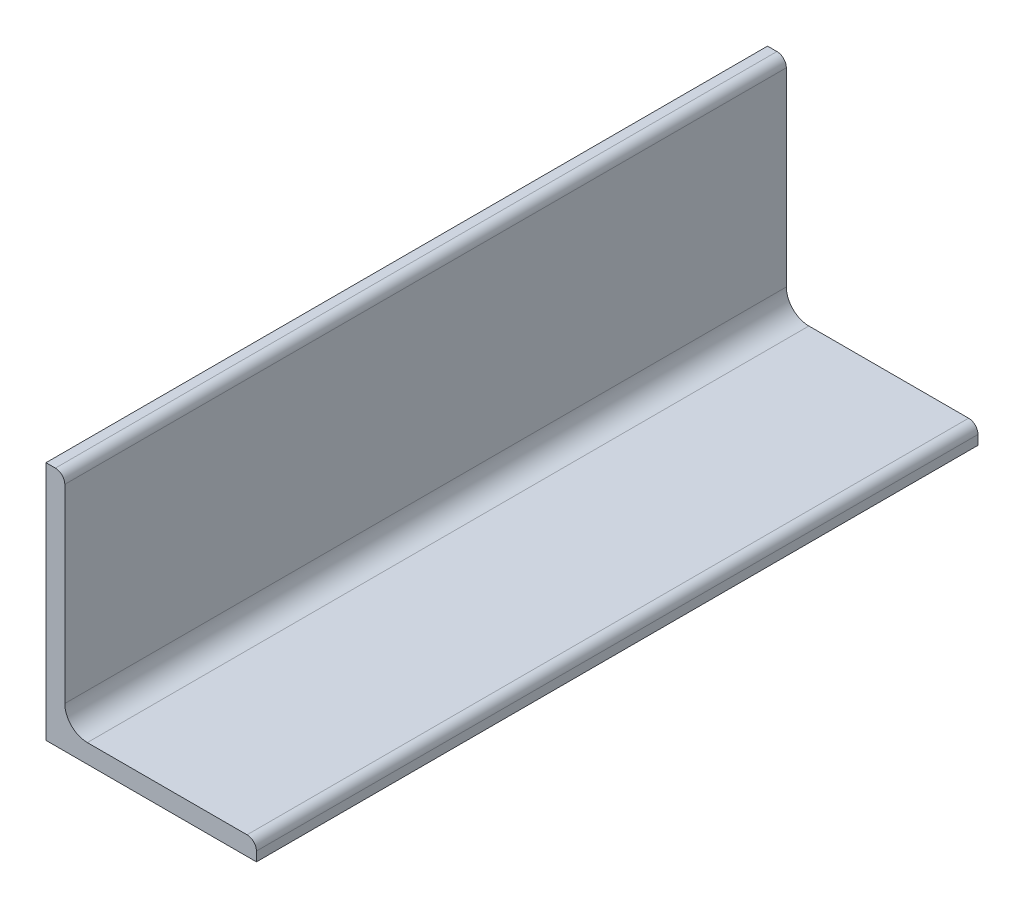
ISO-10303-21;
HEADER;
FILE_DESCRIPTION(('STEP AP214'),'2;1');
FILE_NAME('part.step','',(''),(''),'','','');
FILE_SCHEMA(('AUTOMOTIVE_DESIGN { 1 0 10303 214 1 1 1 1 }'));
ENDSEC;
DATA;
#1=APPLICATION_CONTEXT('core data for automotive mechanical design processes');
#2=APPLICATION_PROTOCOL_DEFINITION('international standard','automotive_design',2000,#1);
#3=PRODUCT_CONTEXT('',#1,'mechanical');
#4=PRODUCT('Part','Part','',(#3));
#5=PRODUCT_RELATED_PRODUCT_CATEGORY('part','',(#4));
#6=PRODUCT_DEFINITION_FORMATION('','',#4);
#7=PRODUCT_DEFINITION_CONTEXT('part definition',#1,'design');
#8=PRODUCT_DEFINITION('design','',#6,#7);
#9=PRODUCT_DEFINITION_SHAPE('','',#8);
#10=(LENGTH_UNIT() NAMED_UNIT(*) SI_UNIT(.MILLI.,.METRE.));
#11=(NAMED_UNIT(*) PLANE_ANGLE_UNIT() SI_UNIT($,.RADIAN.));
#12=(NAMED_UNIT(*) SI_UNIT($,.STERADIAN.) SOLID_ANGLE_UNIT());
#13=UNCERTAINTY_MEASURE_WITH_UNIT(LENGTH_MEASURE(1.E-05),#10,'distance_accuracy_value','');
#14=(GEOMETRIC_REPRESENTATION_CONTEXT(3) GLOBAL_UNCERTAINTY_ASSIGNED_CONTEXT((#13)) GLOBAL_UNIT_ASSIGNED_CONTEXT((#10,
#11,#12)) REPRESENTATION_CONTEXT('',''));
#15=CARTESIAN_POINT('',(0.,0.,0.));
#16=DIRECTION('',(0.,0.,1.));
#17=DIRECTION('',(1.,0.,0.));
#18=AXIS2_PLACEMENT_3D('',#15,#16,#17);
#19=CARTESIAN_POINT('',(0.0836264027816469,102.172018782971,304.8));
#20=DIRECTION('',(1.,0.,0.));
#21=DIRECTION('',(0.,0.,-1.));
#22=AXIS2_PLACEMENT_3D('',#19,#20,#21);
#23=PLANE('',#22);
#24=DIRECTION('',(0.,-1.,0.));
#25=VECTOR('',#24,1.);
#26=CARTESIAN_POINT('',(0.0836264027816469,102.172018782971,0.));
#27=LINE('',#26,#25);
#28=CARTESIAN_POINT('',(0.0836264027816469,102.172018782971,0.));
#29=VERTEX_POINT('',#28);
#30=CARTESIAN_POINT('',(0.0836264027816469,0.572018782971054,0.));
#31=VERTEX_POINT('',#30);
#32=EDGE_CURVE('E135',#29,#31,#27,.T.);
#33=ORIENTED_EDGE('',*,*,#32,.T.);
#34=DIRECTION('',(0.,0.,-1.));
#35=VECTOR('',#34,1.);
#36=CARTESIAN_POINT('',(0.0836264027816469,0.572018782971054,304.8));
#37=LINE('',#36,#35);
#38=CARTESIAN_POINT('',(0.0836264027816469,0.572018782971054,304.8));
#39=VERTEX_POINT('',#38);
#40=EDGE_CURVE('E11',#39,#31,#37,.T.);
#41=ORIENTED_EDGE('',*,*,#40,.F.);
#42=DIRECTION('',(0.,-1.,0.));
#43=VECTOR('',#42,1.);
#44=CARTESIAN_POINT('',(0.0836264027816469,102.172018782971,304.8));
#45=LINE('',#44,#43);
#46=CARTESIAN_POINT('',(0.0836264027816469,102.172018782971,304.8));
#47=VERTEX_POINT('',#46);
#48=EDGE_CURVE('E151',#47,#39,#45,.T.);
#49=ORIENTED_EDGE('',*,*,#48,.F.);
#50=DIRECTION('',(0.,0.,-1.));
#51=VECTOR('',#50,1.);
#52=CARTESIAN_POINT('',(0.0836264027816469,102.172018782971,304.8));
#53=LINE('',#52,#51);
#54=EDGE_CURVE('E131',#47,#29,#53,.T.);
#55=ORIENTED_EDGE('',*,*,#54,.T.);
#56=EDGE_LOOP('',(#33,#41,#49,#55));
#57=FACE_BOUND('',#56,.T.);
#58=ADVANCED_FACE('F33',(#57),#23,.F.);
#59=CARTESIAN_POINT('',(0.0836264027816469,0.572018782971054,304.8));
#60=DIRECTION('',(0.,1.,0.));
#61=DIRECTION('',(0.,0.,1.));
#62=AXIS2_PLACEMENT_3D('',#59,#60,#61);
#63=PLANE('',#62);
#64=DIRECTION('',(1.,0.,0.));
#65=VECTOR('',#64,1.);
#66=CARTESIAN_POINT('',(0.0836264027816469,0.572018782971054,0.));
#67=LINE('',#66,#65);
#68=CARTESIAN_POINT('',(88.9836264027817,0.572018782971054,0.));
#69=VERTEX_POINT('',#68);
#70=EDGE_CURVE('E138',#31,#69,#67,.T.);
#71=ORIENTED_EDGE('',*,*,#70,.T.);
#72=DIRECTION('',(0.,0.,-1.));
#73=VECTOR('',#72,1.);
#74=CARTESIAN_POINT('',(88.9836264027817,0.572018782971054,304.8));
#75=LINE('',#74,#73);
#76=CARTESIAN_POINT('',(88.9836264027817,0.572018782971054,304.8));
#77=VERTEX_POINT('',#76);
#78=EDGE_CURVE('E41',#77,#69,#75,.T.);
#79=ORIENTED_EDGE('',*,*,#78,.F.);
#80=DIRECTION('',(1.,0.,0.));
#81=VECTOR('',#80,1.);
#82=CARTESIAN_POINT('',(0.0836264027816469,0.572018782971054,304.8));
#83=LINE('',#82,#81);
#84=EDGE_CURVE('E95',#39,#77,#83,.T.);
#85=ORIENTED_EDGE('',*,*,#84,.F.);
#86=ORIENTED_EDGE('',*,*,#40,.T.);
#87=EDGE_LOOP('',(#71,#79,#85,#86));
#88=FACE_BOUND('',#87,.T.);
#89=ADVANCED_FACE('F194',(#88),#63,.F.);
#90=CARTESIAN_POINT('',(88.9836264027817,0.572018782971054,304.8));
#91=DIRECTION('',(-1.,0.,0.));
#92=DIRECTION('',(0.,0.,1.));
#93=AXIS2_PLACEMENT_3D('',#90,#91,#92);
#94=PLANE('',#93);
#95=DIRECTION('',(0.,1.,0.));
#96=VECTOR('',#95,1.);
#97=CARTESIAN_POINT('',(88.9836264027817,0.572018782971054,0.));
#98=LINE('',#97,#96);
#99=CARTESIAN_POINT('',(88.9836264027817,4.54076878297105,0.));
#100=VERTEX_POINT('',#99);
#101=EDGE_CURVE('E140',#69,#100,#98,.T.);
#102=ORIENTED_EDGE('',*,*,#101,.T.);
#103=DIRECTION('',(0.,0.,-1.));
#104=VECTOR('',#103,1.);
#105=CARTESIAN_POINT('',(88.9836264027817,4.54076878297105,304.8));
#106=LINE('',#105,#104);
#107=CARTESIAN_POINT('',(88.9836264027817,4.54076878297105,304.8));
#108=VERTEX_POINT('',#107);
#109=EDGE_CURVE('E161',#108,#100,#106,.T.);
#110=ORIENTED_EDGE('',*,*,#109,.F.);
#111=DIRECTION('',(0.,1.,0.));
#112=VECTOR('',#111,1.);
#113=CARTESIAN_POINT('',(88.9836264027817,0.572018782971054,304.8));
#114=LINE('',#113,#112);
#115=EDGE_CURVE('E169',#77,#108,#114,.T.);
#116=ORIENTED_EDGE('',*,*,#115,.F.);
#117=ORIENTED_EDGE('',*,*,#78,.T.);
#118=EDGE_LOOP('',(#102,#110,#116,#117));
#119=FACE_BOUND('',#118,.T.);
#120=ADVANCED_FACE('F167',(#119),#94,.F.);
#121=CARTESIAN_POINT('',(85.0148764027816,4.54076878297105,304.8));
#122=DIRECTION('',(0.,0.,-1.));
#123=DIRECTION('',(-1.,0.,0.));
#124=AXIS2_PLACEMENT_3D('',#121,#122,#123);
#125=CYLINDRICAL_SURFACE('',#124,3.96875);
#126=CARTESIAN_POINT('',(85.0148764027816,4.54076878297105,0.));
#127=DIRECTION('',(0.,0.,1.));
#128=DIRECTION('',(1.,0.,0.));
#129=AXIS2_PLACEMENT_3D('',#126,#127,#128);
#130=CIRCLE('',#129,3.96875);
#131=CARTESIAN_POINT('',(85.0148764027816,8.50951878297106,0.));
#132=VERTEX_POINT('',#131);
#133=EDGE_CURVE('E142',#100,#132,#130,.T.);
#134=ORIENTED_EDGE('',*,*,#133,.T.);
#135=DIRECTION('',(0.,0.,-1.));
#136=VECTOR('',#135,1.);
#137=CARTESIAN_POINT('',(85.0148764027816,8.50951878297106,304.8));
#138=LINE('',#137,#136);
#139=CARTESIAN_POINT('',(85.0148764027816,8.50951878297106,304.8));
#140=VERTEX_POINT('',#139);
#141=EDGE_CURVE('E158',#140,#132,#138,.T.);
#142=ORIENTED_EDGE('',*,*,#141,.F.);
#143=CARTESIAN_POINT('',(85.0148764027816,4.54076878297105,304.8));
#144=DIRECTION('',(0.,0.,1.));
#145=DIRECTION('',(1.,0.,0.));
#146=AXIS2_PLACEMENT_3D('',#143,#144,#145);
#147=CIRCLE('',#146,3.96875);
#148=EDGE_CURVE('E185',#108,#140,#147,.T.);
#149=ORIENTED_EDGE('',*,*,#148,.F.);
#150=ORIENTED_EDGE('',*,*,#109,.T.);
#151=EDGE_LOOP('',(#134,#142,#149,#150));
#152=FACE_BOUND('',#151,.T.);
#153=ADVANCED_FACE('F178',(#152),#125,.T.);
#154=CARTESIAN_POINT('',(85.0148764027816,8.50951878297105,304.8));
#155=DIRECTION('',(0.,-1.,0.));
#156=DIRECTION('',(0.,0.,-1.));
#157=AXIS2_PLACEMENT_3D('',#154,#155,#156);
#158=PLANE('',#157);
#159=DIRECTION('',(-1.,0.,0.));
#160=VECTOR('',#159,1.);
#161=CARTESIAN_POINT('',(85.0148764027816,8.50951878297105,0.));
#162=LINE('',#161,#160);
#163=CARTESIAN_POINT('',(17.5461264027816,8.50951878297105,0.));
#164=VERTEX_POINT('',#163);
#165=EDGE_CURVE('E144',#132,#164,#162,.T.);
#166=ORIENTED_EDGE('',*,*,#165,.T.);
#167=DIRECTION('',(0.,0.,-1.));
#168=VECTOR('',#167,1.);
#169=CARTESIAN_POINT('',(17.5461264027816,8.50951878297105,304.8));
#170=LINE('',#169,#168);
#171=CARTESIAN_POINT('',(17.5461264027816,8.50951878297105,304.8));
#172=VERTEX_POINT('',#171);
#173=EDGE_CURVE('E155',#172,#164,#170,.T.);
#174=ORIENTED_EDGE('',*,*,#173,.F.);
#175=DIRECTION('',(-1.,0.,0.));
#176=VECTOR('',#175,1.);
#177=CARTESIAN_POINT('',(85.0148764027816,8.50951878297105,304.8));
#178=LINE('',#177,#176);
#179=EDGE_CURVE('E184',#140,#172,#178,.T.);
#180=ORIENTED_EDGE('',*,*,#179,.F.);
#181=ORIENTED_EDGE('',*,*,#141,.T.);
#182=EDGE_LOOP('',(#166,#174,#180,#181));
#183=FACE_BOUND('',#182,.T.);
#184=ADVANCED_FACE('F182',(#183),#158,.F.);
#185=CARTESIAN_POINT('',(17.5461264027816,18.034518782971,304.8));
#186=DIRECTION('',(0.,0.,-1.));
#187=DIRECTION('',(-1.,0.,0.));
#188=AXIS2_PLACEMENT_3D('',#185,#186,#187);
#189=CYLINDRICAL_SURFACE('',#188,9.52499999999999);
#190=CARTESIAN_POINT('',(17.5461264027816,18.034518782971,0.));
#191=DIRECTION('',(0.,0.,-1.));
#192=DIRECTION('',(1.,0.,0.));
#193=AXIS2_PLACEMENT_3D('',#190,#191,#192);
#194=CIRCLE('',#193,9.52499999999999);
#195=CARTESIAN_POINT('',(8.02112640278165,18.0345187829711,0.));
#196=VERTEX_POINT('',#195);
#197=EDGE_CURVE('E146',#164,#196,#194,.T.);
#198=ORIENTED_EDGE('',*,*,#197,.T.);
#199=DIRECTION('',(0.,0.,-1.));
#200=VECTOR('',#199,1.);
#201=CARTESIAN_POINT('',(8.02112640278165,18.0345187829711,304.8));
#202=LINE('',#201,#200);
#203=CARTESIAN_POINT('',(8.02112640278165,18.0345187829711,304.8));
#204=VERTEX_POINT('',#203);
#205=EDGE_CURVE('E126',#204,#196,#202,.T.);
#206=ORIENTED_EDGE('',*,*,#205,.F.);
#207=CARTESIAN_POINT('',(17.5461264027816,18.034518782971,304.8));
#208=DIRECTION('',(0.,0.,-1.));
#209=DIRECTION('',(1.,0.,0.));
#210=AXIS2_PLACEMENT_3D('',#207,#208,#209);
#211=CIRCLE('',#210,9.52499999999999);
#212=EDGE_CURVE('E117',#172,#204,#211,.T.);
#213=ORIENTED_EDGE('',*,*,#212,.F.);
#214=ORIENTED_EDGE('',*,*,#173,.T.);
#215=EDGE_LOOP('',(#198,#206,#213,#214));
#216=FACE_BOUND('',#215,.T.);
#217=ADVANCED_FACE('F206',(#216),#189,.F.);
#218=CARTESIAN_POINT('',(8.02112640278165,18.0345187829711,304.8));
#219=DIRECTION('',(-1.,0.,0.));
#220=DIRECTION('',(0.,0.,1.));
#221=AXIS2_PLACEMENT_3D('',#218,#219,#220);
#222=PLANE('',#221);
#223=DIRECTION('',(0.,1.,0.));
#224=VECTOR('',#223,1.);
#225=CARTESIAN_POINT('',(8.02112640278165,18.0345187829711,0.));
#226=LINE('',#225,#224);
#227=CARTESIAN_POINT('',(8.02112640278165,98.2032687829711,0.));
#228=VERTEX_POINT('',#227);
#229=EDGE_CURVE('E125',#196,#228,#226,.T.);
#230=ORIENTED_EDGE('',*,*,#229,.T.);
#231=DIRECTION('',(0.,0.,-1.));
#232=VECTOR('',#231,1.);
#233=CARTESIAN_POINT('',(8.02112640278165,98.2032687829711,304.8));
#234=LINE('',#233,#232);
#235=CARTESIAN_POINT('',(8.02112640278165,98.2032687829711,304.8));
#236=VERTEX_POINT('',#235);
#237=EDGE_CURVE('E122',#236,#228,#234,.T.);
#238=ORIENTED_EDGE('',*,*,#237,.F.);
#239=DIRECTION('',(0.,1.,0.));
#240=VECTOR('',#239,1.);
#241=CARTESIAN_POINT('',(8.02112640278165,18.0345187829711,304.8));
#242=LINE('',#241,#240);
#243=EDGE_CURVE('E111',#204,#236,#242,.T.);
#244=ORIENTED_EDGE('',*,*,#243,.F.);
#245=ORIENTED_EDGE('',*,*,#205,.T.);
#246=EDGE_LOOP('',(#230,#238,#244,#245));
#247=FACE_BOUND('',#246,.T.);
#248=ADVANCED_FACE('F123',(#247),#222,.F.);
#249=CARTESIAN_POINT('',(4.05237640278165,98.203268782971,304.8));
#250=DIRECTION('',(0.,0.,-1.));
#251=DIRECTION('',(-1.,0.,0.));
#252=AXIS2_PLACEMENT_3D('',#249,#250,#251);
#253=CYLINDRICAL_SURFACE('',#252,3.96875);
#254=CARTESIAN_POINT('',(4.05237640278165,98.203268782971,0.));
#255=DIRECTION('',(0.,0.,1.));
#256=DIRECTION('',(1.,0.,0.));
#257=AXIS2_PLACEMENT_3D('',#254,#255,#256);
#258=CIRCLE('',#257,3.96875);
#259=CARTESIAN_POINT('',(4.05237640278165,102.172018782971,0.));
#260=VERTEX_POINT('',#259);
#261=EDGE_CURVE('E81',#228,#260,#258,.T.);
#262=ORIENTED_EDGE('',*,*,#261,.T.);
#263=DIRECTION('',(0.,0.,-1.));
#264=VECTOR('',#263,1.);
#265=CARTESIAN_POINT('',(4.05237640278165,102.172018782971,304.8));
#266=LINE('',#265,#264);
#267=CARTESIAN_POINT('',(4.05237640278165,102.172018782971,304.8));
#268=VERTEX_POINT('',#267);
#269=EDGE_CURVE('E127',#268,#260,#266,.T.);
#270=ORIENTED_EDGE('',*,*,#269,.F.);
#271=CARTESIAN_POINT('',(4.05237640278165,98.203268782971,304.8));
#272=DIRECTION('',(0.,0.,1.));
#273=DIRECTION('',(1.,0.,0.));
#274=AXIS2_PLACEMENT_3D('',#271,#272,#273);
#275=CIRCLE('',#274,3.96875);
#276=EDGE_CURVE('E115',#236,#268,#275,.T.);
#277=ORIENTED_EDGE('',*,*,#276,.F.);
#278=ORIENTED_EDGE('',*,*,#237,.T.);
#279=EDGE_LOOP('',(#262,#270,#277,#278));
#280=FACE_BOUND('',#279,.T.);
#281=ADVANCED_FACE('F129',(#280),#253,.T.);
#282=CARTESIAN_POINT('',(4.05237640278165,102.172018782971,304.8));
#283=DIRECTION('',(0.,-1.,0.));
#284=DIRECTION('',(0.,0.,-1.));
#285=AXIS2_PLACEMENT_3D('',#282,#283,#284);
#286=PLANE('',#285);
#287=DIRECTION('',(-1.,0.,0.));
#288=VECTOR('',#287,1.);
#289=CARTESIAN_POINT('',(4.05237640278165,102.172018782971,0.));
#290=LINE('',#289,#288);
#291=EDGE_CURVE('E87',#260,#29,#290,.T.);
#292=ORIENTED_EDGE('',*,*,#291,.T.);
#293=ORIENTED_EDGE('',*,*,#54,.F.);
#294=DIRECTION('',(-1.,0.,0.));
#295=VECTOR('',#294,1.);
#296=CARTESIAN_POINT('',(4.05237640278165,102.172018782971,304.8));
#297=LINE('',#296,#295);
#298=EDGE_CURVE('E49',#268,#47,#297,.T.);
#299=ORIENTED_EDGE('',*,*,#298,.F.);
#300=ORIENTED_EDGE('',*,*,#269,.T.);
#301=EDGE_LOOP('',(#292,#293,#299,#300));
#302=FACE_BOUND('',#301,.T.);
#303=ADVANCED_FACE('F214',(#302),#286,.F.);
#304=CARTESIAN_POINT('',(85.0148764027816,4.54076878297105,304.8));
#305=DIRECTION('',(0.,0.,1.));
#306=DIRECTION('',(1.,0.,0.));
#307=AXIS2_PLACEMENT_3D('',#304,#305,#306);
#308=PLANE('',#307);
#309=ORIENTED_EDGE('',*,*,#48,.T.);
#310=ORIENTED_EDGE('',*,*,#84,.T.);
#311=ORIENTED_EDGE('',*,*,#115,.T.);
#312=ORIENTED_EDGE('',*,*,#148,.T.);
#313=ORIENTED_EDGE('',*,*,#179,.T.);
#314=ORIENTED_EDGE('',*,*,#212,.T.);
#315=ORIENTED_EDGE('',*,*,#243,.T.);
#316=ORIENTED_EDGE('',*,*,#276,.T.);
#317=ORIENTED_EDGE('',*,*,#298,.T.);
#318=EDGE_LOOP('',(#309,#310,#311,#312,#313,#314,#315,#316,#317));
#319=FACE_BOUND('',#318,.T.);
#320=ADVANCED_FACE('F113',(#319),#308,.T.);
#321=CARTESIAN_POINT('',(85.0148764027816,4.54076878297105,0.));
#322=DIRECTION('',(0.,0.,1.));
#323=DIRECTION('',(1.,0.,0.));
#324=AXIS2_PLACEMENT_3D('',#321,#322,#323);
#325=PLANE('',#324);
#326=ORIENTED_EDGE('',*,*,#32,.F.);
#327=ORIENTED_EDGE('',*,*,#291,.F.);
#328=ORIENTED_EDGE('',*,*,#261,.F.);
#329=ORIENTED_EDGE('',*,*,#229,.F.);
#330=ORIENTED_EDGE('',*,*,#197,.F.);
#331=ORIENTED_EDGE('',*,*,#165,.F.);
#332=ORIENTED_EDGE('',*,*,#133,.F.);
#333=ORIENTED_EDGE('',*,*,#101,.F.);
#334=ORIENTED_EDGE('',*,*,#70,.F.);
#335=EDGE_LOOP('',(#326,#327,#328,#329,#330,#331,#332,#333,#334));
#336=FACE_BOUND('',#335,.T.);
#337=ADVANCED_FACE('F173',(#336),#325,.F.);
#338=CLOSED_SHELL('',(#58,#89,#120,#153,#184,#217,#248,#281,#303,#320,#337));
#339=MANIFOLD_SOLID_BREP('B2',#338);
#340=ADVANCED_BREP_SHAPE_REPRESENTATION('',(#18,#339),#14);
#341=SHAPE_DEFINITION_REPRESENTATION(#9,#340);
ENDSEC;
END-ISO-10303-21;
